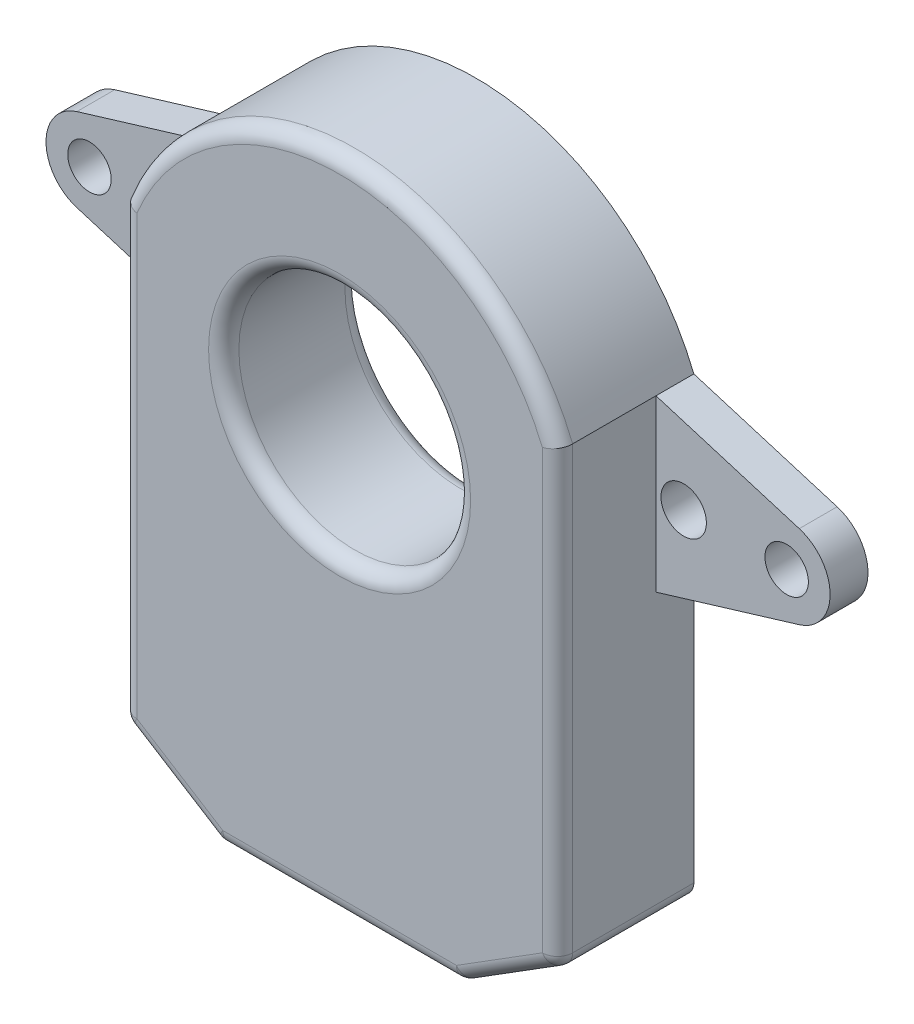
ISO-10303-21;
HEADER;
FILE_DESCRIPTION(('STEP AP214'),'2;1');
FILE_NAME('part.step','',(''),(''),'','','');
FILE_SCHEMA(('AUTOMOTIVE_DESIGN { 1 0 10303 214 1 1 1 1 }'));
ENDSEC;
DATA;
#1=APPLICATION_CONTEXT('core data for automotive mechanical design processes');
#2=APPLICATION_PROTOCOL_DEFINITION('international standard','automotive_design',2000,#1);
#3=PRODUCT_CONTEXT('',#1,'mechanical');
#4=PRODUCT('Part','Part','',(#3));
#5=PRODUCT_RELATED_PRODUCT_CATEGORY('part','',(#4));
#6=PRODUCT_DEFINITION_FORMATION('','',#4);
#7=PRODUCT_DEFINITION_CONTEXT('part definition',#1,'design');
#8=PRODUCT_DEFINITION('design','',#6,#7);
#9=PRODUCT_DEFINITION_SHAPE('','',#8);
#10=(LENGTH_UNIT() NAMED_UNIT(*) SI_UNIT(.MILLI.,.METRE.));
#11=(NAMED_UNIT(*) PLANE_ANGLE_UNIT() SI_UNIT($,.RADIAN.));
#12=(NAMED_UNIT(*) SI_UNIT($,.STERADIAN.) SOLID_ANGLE_UNIT());
#13=UNCERTAINTY_MEASURE_WITH_UNIT(LENGTH_MEASURE(1.E-05),#10,'distance_accuracy_value','');
#14=(GEOMETRIC_REPRESENTATION_CONTEXT(3) GLOBAL_UNCERTAINTY_ASSIGNED_CONTEXT((#13)) GLOBAL_UNIT_ASSIGNED_CONTEXT((#10,
#11,#12)) REPRESENTATION_CONTEXT('',''));
#15=CARTESIAN_POINT('',(0.,0.,0.));
#16=DIRECTION('',(0.,0.,1.));
#17=DIRECTION('',(1.,0.,0.));
#18=AXIS2_PLACEMENT_3D('',#15,#16,#17);
#19=CARTESIAN_POINT('',(14.385,27.88,9.));
#20=DIRECTION('',(0.,0.,-1.));
#21=DIRECTION('',(-1.,0.,0.));
#22=AXIS2_PLACEMENT_3D('',#19,#20,#21);
#23=PLANE('',#22);
#24=CARTESIAN_POINT('',(14.385,28.04,9.));
#25=DIRECTION('',(0.,0.,-1.));
#26=DIRECTION('',(-1.,0.,0.));
#27=AXIS2_PLACEMENT_3D('',#24,#25,#26);
#28=CIRCLE('',#27,8.65);
#29=CARTESIAN_POINT('',(5.73500000000001,28.04,9.));
#30=VERTEX_POINT('',#29);
#31=EDGE_CURVE('E307',#30,#30,#28,.T.);
#32=ORIENTED_EDGE('',*,*,#31,.T.);
#33=EDGE_LOOP('',(#32));
#34=FACE_BOUND('',#33,.T.);
#35=DIRECTION('',(0.847438604342457,-0.530893409141712,0.));
#36=VECTOR('',#35,1.);
#37=CARTESIAN_POINT('',(0.117910911010049,5.1061590416998,9.));
#38=LINE('',#37,#36);
#39=CARTESIAN_POINT('',(0.999999999999999,4.55355820286506,9.));
#40=VERTEX_POINT('',#39);
#41=CARTESIAN_POINT('',(6.67236728132335,1.,9.));
#42=VERTEX_POINT('',#41);
#43=EDGE_CURVE('E296',#40,#42,#38,.T.);
#44=ORIENTED_EDGE('',*,*,#43,.T.);
#45=DIRECTION('',(1.,0.,0.));
#46=VECTOR('',#45,1.);
#47=CARTESIAN_POINT('',(14.385,1.,9.));
#48=LINE('',#47,#46);
#49=CARTESIAN_POINT('',(22.0976327186766,1.,9.));
#50=VERTEX_POINT('',#49);
#51=EDGE_CURVE('E305',#42,#50,#48,.T.);
#52=ORIENTED_EDGE('',*,*,#51,.T.);
#53=DIRECTION('',(0.847438604342457,0.530893409141712,0.));
#54=VECTOR('',#53,1.);
#55=CARTESIAN_POINT('',(28.65208908899,5.1061590416998,9.));
#56=LINE('',#55,#54);
#57=CARTESIAN_POINT('',(27.77,4.55355820286506,9.));
#58=VERTEX_POINT('',#57);
#59=EDGE_CURVE('E303',#50,#58,#56,.T.);
#60=ORIENTED_EDGE('',*,*,#59,.T.);
#61=DIRECTION('',(0.,1.,0.));
#62=VECTOR('',#61,1.);
#63=CARTESIAN_POINT('',(27.77,27.88,9.));
#64=LINE('',#63,#62);
#65=CARTESIAN_POINT('',(27.77,33.45599991033,9.));
#66=VERTEX_POINT('',#65);
#67=EDGE_CURVE('E301',#58,#66,#64,.T.);
#68=ORIENTED_EDGE('',*,*,#67,.T.);
#69=CARTESIAN_POINT('',(14.385,27.88,9.));
#70=DIRECTION('',(0.,0.,-1.));
#71=DIRECTION('',(-1.,0.,0.));
#72=AXIS2_PLACEMENT_3D('',#69,#70,#71);
#73=CIRCLE('',#72,14.5);
#74=CARTESIAN_POINT('',(0.999999999999999,33.45599991033,9.));
#75=VERTEX_POINT('',#74);
#76=EDGE_CURVE('E298',#66,#75,#73,.F.);
#77=ORIENTED_EDGE('',*,*,#76,.T.);
#78=DIRECTION('',(0.,-1.,0.));
#79=VECTOR('',#78,1.);
#80=CARTESIAN_POINT('',(0.999999999999999,27.88,9.));
#81=LINE('',#80,#79);
#82=EDGE_CURVE('E294',#75,#40,#81,.T.);
#83=ORIENTED_EDGE('',*,*,#82,.T.);
#84=EDGE_LOOP('',(#44,#52,#60,#68,#77,#83));
#85=FACE_BOUND('',#84,.T.);
#86=ADVANCED_FACE('F33',(#34,#85),#23,.F.);
#87=CARTESIAN_POINT('',(14.385,27.88,0.));
#88=DIRECTION('',(0.,0.,-1.));
#89=DIRECTION('',(-1.,0.,0.));
#90=AXIS2_PLACEMENT_3D('',#87,#88,#89);
#91=PLANE('',#90);
#92=CARTESIAN_POINT('',(14.385,28.04,0.));
#93=DIRECTION('',(0.,0.,-1.));
#94=DIRECTION('',(-1.,0.,0.));
#95=AXIS2_PLACEMENT_3D('',#92,#93,#94);
#96=CIRCLE('',#95,8.65);
#97=CARTESIAN_POINT('',(5.73500000000001,28.04,0.));
#98=VERTEX_POINT('',#97);
#99=EDGE_CURVE('E285',#98,#98,#96,.F.);
#100=ORIENTED_EDGE('',*,*,#99,.T.);
#101=EDGE_LOOP('',(#100));
#102=FACE_BOUND('',#101,.T.);
#103=DIRECTION('',(0.847438604342457,0.530893409141711,0.));
#104=VECTOR('',#103,1.);
#105=CARTESIAN_POINT('',(22.385,0.,0.));
#106=LINE('',#105,#104);
#107=CARTESIAN_POINT('',(22.6285261278184,0.152561395657544,0.));
#108=VERTEX_POINT('',#107);
#109=CARTESIAN_POINT('',(28.3008934091417,3.7061195985226,0.));
#110=VERTEX_POINT('',#109);
#111=EDGE_CURVE('E261',#108,#110,#106,.T.);
#112=ORIENTED_EDGE('',*,*,#111,.F.);
#113=CARTESIAN_POINT('',(22.0976327186766,1.,0.));
#114=DIRECTION('',(0.,0.,-1.));
#115=DIRECTION('',(-1.,0.,0.));
#116=AXIS2_PLACEMENT_3D('',#113,#114,#115);
#117=CIRCLE('',#116,1.);
#118=CARTESIAN_POINT('',(22.0976327186766,0.,0.));
#119=VERTEX_POINT('',#118);
#120=EDGE_CURVE('E283',#108,#119,#117,.T.);
#121=ORIENTED_EDGE('',*,*,#120,.T.);
#122=DIRECTION('',(1.,0.,0.));
#123=VECTOR('',#122,1.);
#124=CARTESIAN_POINT('',(6.385,0.,0.));
#125=LINE('',#124,#123);
#126=CARTESIAN_POINT('',(6.67236728132336,0.,0.));
#127=VERTEX_POINT('',#126);
#128=EDGE_CURVE('E258',#127,#119,#125,.T.);
#129=ORIENTED_EDGE('',*,*,#128,.F.);
#130=CARTESIAN_POINT('',(6.67236728132336,1.,0.));
#131=DIRECTION('',(0.,0.,-1.));
#132=DIRECTION('',(-1.,0.,0.));
#133=AXIS2_PLACEMENT_3D('',#130,#131,#132);
#134=CIRCLE('',#133,1.);
#135=CARTESIAN_POINT('',(6.14147387218165,0.152561395657543,0.));
#136=VERTEX_POINT('',#135);
#137=EDGE_CURVE('E281',#127,#136,#134,.T.);
#138=ORIENTED_EDGE('',*,*,#137,.T.);
#139=DIRECTION('',(0.847438604342457,-0.530893409141711,0.));
#140=VECTOR('',#139,1.);
#141=CARTESIAN_POINT('',(6.385,0.,0.));
#142=LINE('',#141,#140);
#143=CARTESIAN_POINT('',(0.469106590858289,3.70611959852261,0.));
#144=VERTEX_POINT('',#143);
#145=EDGE_CURVE('E255',#144,#136,#142,.T.);
#146=ORIENTED_EDGE('',*,*,#145,.F.);
#147=CARTESIAN_POINT('',(1.,4.55355820286506,0.));
#148=DIRECTION('',(0.,0.,-1.));
#149=DIRECTION('',(-1.,0.,0.));
#150=AXIS2_PLACEMENT_3D('',#147,#148,#149);
#151=CIRCLE('',#150,1.);
#152=CARTESIAN_POINT('',(0.,4.55355820286506,0.));
#153=VERTEX_POINT('',#152);
#154=EDGE_CURVE('E278',#144,#153,#151,.T.);
#155=ORIENTED_EDGE('',*,*,#154,.T.);
#156=DIRECTION('',(0.,-1.,0.));
#157=VECTOR('',#156,1.);
#158=CARTESIAN_POINT('',(0.,4.,0.));
#159=LINE('',#158,#157);
#160=CARTESIAN_POINT('',(0.,22.4274983759205,0.));
#161=VERTEX_POINT('',#160);
#162=EDGE_CURVE('E269',#161,#153,#159,.T.);
#163=ORIENTED_EDGE('',*,*,#162,.F.);
#164=DIRECTION('',(-0.957046048370867,0.289935960683921,0.));
#165=VECTOR('',#164,1.);
#166=CARTESIAN_POINT('',(0.,22.4274983759205,0.));
#167=LINE('',#166,#165);
#168=CARTESIAN_POINT('',(-9.45961620716281,25.2932778411758,0.));
#169=VERTEX_POINT('',#168);
#170=EDGE_CURVE('E194',#161,#169,#167,.T.);
#171=ORIENTED_EDGE('',*,*,#170,.T.);
#172=CARTESIAN_POINT('',(-8.6275,28.04,0.));
#173=DIRECTION('',(0.,0.,-1.));
#174=DIRECTION('',(1.,0.,0.));
#175=AXIS2_PLACEMENT_3D('',#172,#173,#174);
#176=CIRCLE('',#175,2.86999999999989);
#177=CARTESIAN_POINT('',(-9.45961620716277,30.7867221588244,0.));
#178=VERTEX_POINT('',#177);
#179=EDGE_CURVE('E204',#169,#178,#176,.T.);
#180=ORIENTED_EDGE('',*,*,#179,.T.);
#181=DIRECTION('',(0.957046048370873,0.2899359606839,0.));
#182=VECTOR('',#181,1.);
#183=CARTESIAN_POINT('',(0.,33.6525016240795,0.));
#184=LINE('',#183,#182);
#185=CARTESIAN_POINT('',(0.,33.6525016240795,0.));
#186=VERTEX_POINT('',#185);
#187=EDGE_CURVE('E178',#178,#186,#184,.T.);
#188=ORIENTED_EDGE('',*,*,#187,.T.);
#189=CARTESIAN_POINT('',(14.385,27.88,0.));
#190=DIRECTION('',(0.,0.,1.));
#191=DIRECTION('',(-1.,0.,0.));
#192=AXIS2_PLACEMENT_3D('',#189,#190,#191);
#193=CIRCLE('',#192,15.5);
#194=CARTESIAN_POINT('',(28.77,33.6525016240795,0.));
#195=VERTEX_POINT('',#194);
#196=EDGE_CURVE('E267',#195,#186,#193,.T.);
#197=ORIENTED_EDGE('',*,*,#196,.F.);
#198=DIRECTION('',(0.957046048370873,-0.2899359606839,0.));
#199=VECTOR('',#198,1.);
#200=CARTESIAN_POINT('',(28.77,33.6525016240795,0.));
#201=LINE('',#200,#199);
#202=CARTESIAN_POINT('',(38.2296162071628,30.7867221588244,0.));
#203=VERTEX_POINT('',#202);
#204=EDGE_CURVE('E222',#195,#203,#201,.T.);
#205=ORIENTED_EDGE('',*,*,#204,.T.);
#206=CARTESIAN_POINT('',(37.3975,28.04,0.));
#207=DIRECTION('',(0.,0.,-1.));
#208=DIRECTION('',(-1.,0.,0.));
#209=AXIS2_PLACEMENT_3D('',#206,#207,#208);
#210=CIRCLE('',#209,2.87);
#211=CARTESIAN_POINT('',(38.2296162071628,25.2932778411756,0.));
#212=VERTEX_POINT('',#211);
#213=EDGE_CURVE('E241',#203,#212,#210,.T.);
#214=ORIENTED_EDGE('',*,*,#213,.T.);
#215=DIRECTION('',(-0.957046048370873,-0.2899359606839,0.));
#216=VECTOR('',#215,1.);
#217=CARTESIAN_POINT('',(28.77,22.4274983759205,0.));
#218=LINE('',#217,#216);
#219=CARTESIAN_POINT('',(28.77,22.4274983759205,0.));
#220=VERTEX_POINT('',#219);
#221=EDGE_CURVE('E229',#212,#220,#218,.T.);
#222=ORIENTED_EDGE('',*,*,#221,.T.);
#223=DIRECTION('',(0.,1.,0.));
#224=VECTOR('',#223,1.);
#225=CARTESIAN_POINT('',(28.77,33.6525016240795,0.));
#226=LINE('',#225,#224);
#227=CARTESIAN_POINT('',(28.77,4.55355820286506,0.));
#228=VERTEX_POINT('',#227);
#229=EDGE_CURVE('E264',#228,#220,#226,.T.);
#230=ORIENTED_EDGE('',*,*,#229,.F.);
#231=CARTESIAN_POINT('',(27.77,4.55355820286506,0.));
#232=DIRECTION('',(0.,0.,-1.));
#233=DIRECTION('',(-1.,0.,0.));
#234=AXIS2_PLACEMENT_3D('',#231,#232,#233);
#235=CIRCLE('',#234,1.);
#236=EDGE_CURVE('E276',#228,#110,#235,.T.);
#237=ORIENTED_EDGE('',*,*,#236,.T.);
#238=EDGE_LOOP('',(#112,#121,#129,#138,#146,#155,#163,#171,#180,#188,#197,#205,#214,#222,#230,#237));
#239=FACE_BOUND('',#238,.T.);
#240=CARTESIAN_POINT('',(37.3975,28.04,0.));
#241=DIRECTION('',(0.,0.,-1.));
#242=DIRECTION('',(-1.,0.,0.));
#243=AXIS2_PLACEMENT_3D('',#240,#241,#242);
#244=CIRCLE('',#243,1.435);
#245=CARTESIAN_POINT('',(35.9625,28.04,0.));
#246=VERTEX_POINT('',#245);
#247=EDGE_CURVE('E209',#246,#246,#244,.T.);
#248=ORIENTED_EDGE('',*,*,#247,.F.);
#249=EDGE_LOOP('',(#248));
#250=FACE_BOUND('',#249,.T.);
#251=CARTESIAN_POINT('',(30.6,28.04,0.));
#252=DIRECTION('',(0.,0.,-1.));
#253=DIRECTION('',(-1.,0.,0.));
#254=AXIS2_PLACEMENT_3D('',#251,#252,#253);
#255=CIRCLE('',#254,1.5);
#256=CARTESIAN_POINT('',(29.1,28.04,0.));
#257=VERTEX_POINT('',#256);
#258=EDGE_CURVE('E216',#257,#257,#255,.T.);
#259=ORIENTED_EDGE('',*,*,#258,.F.);
#260=EDGE_LOOP('',(#259));
#261=FACE_BOUND('',#260,.T.);
#262=CARTESIAN_POINT('',(-1.83,28.04,0.));
#263=DIRECTION('',(0.,0.,-1.));
#264=DIRECTION('',(1.,0.,0.));
#265=AXIS2_PLACEMENT_3D('',#262,#263,#264);
#266=CIRCLE('',#265,1.50000000000001);
#267=CARTESIAN_POINT('',(-0.329999999999991,28.04,0.));
#268=VERTEX_POINT('',#267);
#269=EDGE_CURVE('E470',#268,#268,#266,.T.);
#270=ORIENTED_EDGE('',*,*,#269,.F.);
#271=EDGE_LOOP('',(#270));
#272=FACE_BOUND('',#271,.T.);
#273=CARTESIAN_POINT('',(-8.6275,28.04,0.));
#274=DIRECTION('',(0.,0.,-1.));
#275=DIRECTION('',(1.,0.,0.));
#276=AXIS2_PLACEMENT_3D('',#273,#274,#275);
#277=CIRCLE('',#276,1.435);
#278=CARTESIAN_POINT('',(-7.19249999999999,28.04,0.));
#279=VERTEX_POINT('',#278);
#280=EDGE_CURVE('E199',#279,#279,#277,.T.);
#281=ORIENTED_EDGE('',*,*,#280,.F.);
#282=EDGE_LOOP('',(#281));
#283=FACE_BOUND('',#282,.T.);
#284=ADVANCED_FACE('F405',(#102,#239,#250,#261,#272,#283),#91,.T.);
#285=CARTESIAN_POINT('',(6.385,0.,9.));
#286=DIRECTION('',(0.530893409141712,0.847438604342457,0.));
#287=DIRECTION('',(-0.847438604342457,0.530893409141712,0.));
#288=AXIS2_PLACEMENT_3D('',#285,#286,#287);
#289=PLANE('',#288);
#290=ORIENTED_EDGE('',*,*,#145,.T.);
#291=DIRECTION('',(0.,0.,-1.));
#292=VECTOR('',#291,1.);
#293=CARTESIAN_POINT('',(6.14147387218165,0.152561395657543,9.));
#294=LINE('',#293,#292);
#295=CARTESIAN_POINT('',(6.14147387218165,0.152561395657543,8.));
#296=VERTEX_POINT('',#295);
#297=EDGE_CURVE('E329',#136,#296,#294,.F.);
#298=ORIENTED_EDGE('',*,*,#297,.T.);
#299=DIRECTION('',(0.847438604342457,-0.530893409141712,0.));
#300=VECTOR('',#299,1.);
#301=CARTESIAN_POINT('',(6.385,0.,8.));
#302=LINE('',#301,#300);
#303=CARTESIAN_POINT('',(0.469106590858289,3.70611959852261,8.));
#304=VERTEX_POINT('',#303);
#305=EDGE_CURVE('E325',#296,#304,#302,.F.);
#306=ORIENTED_EDGE('',*,*,#305,.T.);
#307=DIRECTION('',(0.,0.,-1.));
#308=VECTOR('',#307,1.);
#309=CARTESIAN_POINT('',(0.469106590858288,3.70611959852261,9.));
#310=LINE('',#309,#308);
#311=EDGE_CURVE('E327',#304,#144,#310,.T.);
#312=ORIENTED_EDGE('',*,*,#311,.T.);
#313=EDGE_LOOP('',(#290,#298,#306,#312));
#314=FACE_BOUND('',#313,.T.);
#315=ADVANCED_FACE('F412',(#314),#289,.F.);
#316=CARTESIAN_POINT('',(6.385,0.,9.));
#317=DIRECTION('',(0.,1.,0.));
#318=DIRECTION('',(0.,0.,1.));
#319=AXIS2_PLACEMENT_3D('',#316,#317,#318);
#320=PLANE('',#319);
#321=ORIENTED_EDGE('',*,*,#128,.T.);
#322=DIRECTION('',(0.,0.,-1.));
#323=VECTOR('',#322,1.);
#324=CARTESIAN_POINT('',(22.0976327186766,0.,9.));
#325=LINE('',#324,#323);
#326=CARTESIAN_POINT('',(22.0976327186766,0.,8.));
#327=VERTEX_POINT('',#326);
#328=EDGE_CURVE('E323',#119,#327,#325,.F.);
#329=ORIENTED_EDGE('',*,*,#328,.T.);
#330=DIRECTION('',(1.,0.,0.));
#331=VECTOR('',#330,1.);
#332=CARTESIAN_POINT('',(6.385,0.,8.));
#333=LINE('',#332,#331);
#334=CARTESIAN_POINT('',(6.67236728132336,0.,8.));
#335=VERTEX_POINT('',#334);
#336=EDGE_CURVE('E319',#327,#335,#333,.F.);
#337=ORIENTED_EDGE('',*,*,#336,.T.);
#338=DIRECTION('',(0.,0.,-1.));
#339=VECTOR('',#338,1.);
#340=CARTESIAN_POINT('',(6.67236728132336,0.,9.));
#341=LINE('',#340,#339);
#342=EDGE_CURVE('E321',#335,#127,#341,.T.);
#343=ORIENTED_EDGE('',*,*,#342,.T.);
#344=EDGE_LOOP('',(#321,#329,#337,#343));
#345=FACE_BOUND('',#344,.T.);
#346=ADVANCED_FACE('F433',(#345),#320,.F.);
#347=CARTESIAN_POINT('',(22.385,0.,9.));
#348=DIRECTION('',(-0.530893409141712,0.847438604342457,0.));
#349=DIRECTION('',(-0.847438604342457,-0.530893409141712,0.));
#350=AXIS2_PLACEMENT_3D('',#347,#348,#349);
#351=PLANE('',#350);
#352=DIRECTION('',(0.847438604342457,0.530893409141712,0.));
#353=VECTOR('',#352,1.);
#354=CARTESIAN_POINT('',(22.385,0.,8.));
#355=LINE('',#354,#353);
#356=CARTESIAN_POINT('',(28.3008934091417,3.70611959852261,8.));
#357=VERTEX_POINT('',#356);
#358=CARTESIAN_POINT('',(22.6285261278184,0.152561395657544,8.));
#359=VERTEX_POINT('',#358);
#360=EDGE_CURVE('E313',#357,#359,#355,.F.);
#361=ORIENTED_EDGE('',*,*,#360,.T.);
#362=DIRECTION('',(0.,0.,-1.));
#363=VECTOR('',#362,1.);
#364=CARTESIAN_POINT('',(22.6285261278184,0.152561395657544,9.));
#365=LINE('',#364,#363);
#366=EDGE_CURVE('E317',#359,#108,#365,.T.);
#367=ORIENTED_EDGE('',*,*,#366,.T.);
#368=ORIENTED_EDGE('',*,*,#111,.T.);
#369=DIRECTION('',(0.,0.,-1.));
#370=VECTOR('',#369,1.);
#371=CARTESIAN_POINT('',(28.3008934091417,3.70611959852261,9.));
#372=LINE('',#371,#370);
#373=EDGE_CURVE('E315',#110,#357,#372,.F.);
#374=ORIENTED_EDGE('',*,*,#373,.T.);
#375=EDGE_LOOP('',(#361,#367,#368,#374));
#376=FACE_BOUND('',#375,.T.);
#377=ADVANCED_FACE('F429',(#376),#351,.F.);
#378=CARTESIAN_POINT('',(28.77,33.6525016240795,9.));
#379=DIRECTION('',(-1.,0.,0.));
#380=DIRECTION('',(0.,0.,1.));
#381=AXIS2_PLACEMENT_3D('',#378,#379,#380);
#382=PLANE('',#381);
#383=ORIENTED_EDGE('',*,*,#229,.T.);
#384=DIRECTION('',(0.,0.,-1.));
#385=VECTOR('',#384,1.);
#386=CARTESIAN_POINT('',(28.77,22.4274983759205,2.5));
#387=LINE('',#386,#385);
#388=CARTESIAN_POINT('',(28.77,22.4274983759205,2.5));
#389=VERTEX_POINT('',#388);
#390=EDGE_CURVE('E246',#389,#220,#387,.T.);
#391=ORIENTED_EDGE('',*,*,#390,.F.);
#392=DIRECTION('',(0.,1.,0.));
#393=VECTOR('',#392,1.);
#394=CARTESIAN_POINT('',(28.77,33.6525016240795,2.5));
#395=LINE('',#394,#393);
#396=CARTESIAN_POINT('',(28.77,33.6525016240795,2.5));
#397=VERTEX_POINT('',#396);
#398=EDGE_CURVE('E225',#389,#397,#395,.T.);
#399=ORIENTED_EDGE('',*,*,#398,.T.);
#400=DIRECTION('',(0.,0.,-1.));
#401=VECTOR('',#400,1.);
#402=CARTESIAN_POINT('',(28.77,33.6525016240795,9.));
#403=LINE('',#402,#401);
#404=CARTESIAN_POINT('',(28.77,33.6525016240795,8.));
#405=VERTEX_POINT('',#404);
#406=EDGE_CURVE('E273',#405,#397,#403,.T.);
#407=ORIENTED_EDGE('',*,*,#406,.F.);
#408=DIRECTION('',(0.,1.,0.));
#409=VECTOR('',#408,1.);
#410=CARTESIAN_POINT('',(28.77,33.6525016240795,8.));
#411=LINE('',#410,#409);
#412=CARTESIAN_POINT('',(28.77,4.55355820286506,8.));
#413=VERTEX_POINT('',#412);
#414=EDGE_CURVE('E42',#405,#413,#411,.F.);
#415=ORIENTED_EDGE('',*,*,#414,.T.);
#416=DIRECTION('',(0.,0.,-1.));
#417=VECTOR('',#416,1.);
#418=CARTESIAN_POINT('',(28.77,4.55355820286506,9.));
#419=LINE('',#418,#417);
#420=EDGE_CURVE('E11',#413,#228,#419,.T.);
#421=ORIENTED_EDGE('',*,*,#420,.T.);
#422=EDGE_LOOP('',(#383,#391,#399,#407,#415,#421));
#423=FACE_BOUND('',#422,.T.);
#424=ADVANCED_FACE('F426',(#423),#382,.F.);
#425=CARTESIAN_POINT('',(14.385,27.88,9.));
#426=DIRECTION('',(0.,0.,-1.));
#427=DIRECTION('',(-1.,0.,0.));
#428=AXIS2_PLACEMENT_3D('',#425,#426,#427);
#429=CYLINDRICAL_SURFACE('',#428,15.5);
#430=DIRECTION('',(0.,0.,-1.));
#431=VECTOR('',#430,1.);
#432=CARTESIAN_POINT('',(0.,33.6525016240795,9.));
#433=LINE('',#432,#431);
#434=CARTESIAN_POINT('',(0.,33.6525016240795,8.));
#435=VERTEX_POINT('',#434);
#436=CARTESIAN_POINT('',(0.,33.6525016240795,2.5));
#437=VERTEX_POINT('',#436);
#438=EDGE_CURVE('E271',#435,#437,#433,.T.);
#439=ORIENTED_EDGE('',*,*,#438,.F.);
#440=CARTESIAN_POINT('',(14.385,27.88,8.));
#441=DIRECTION('',(0.,0.,-1.));
#442=DIRECTION('',(-1.,0.,0.));
#443=AXIS2_PLACEMENT_3D('',#440,#441,#442);
#444=CIRCLE('',#443,15.5);
#445=EDGE_CURVE('E310',#435,#405,#444,.T.);
#446=ORIENTED_EDGE('',*,*,#445,.T.);
#447=ORIENTED_EDGE('',*,*,#406,.T.);
#448=DIRECTION('',(0.,0.,-1.));
#449=VECTOR('',#448,1.);
#450=CARTESIAN_POINT('',(28.77,33.6525016240795,2.5));
#451=LINE('',#450,#449);
#452=EDGE_CURVE('E238',#397,#195,#451,.T.);
#453=ORIENTED_EDGE('',*,*,#452,.T.);
#454=ORIENTED_EDGE('',*,*,#196,.T.);
#455=DIRECTION('',(0.,0.,-1.));
#456=VECTOR('',#455,1.);
#457=CARTESIAN_POINT('',(0.,33.6525016240795,2.5));
#458=LINE('',#457,#456);
#459=EDGE_CURVE('E58',#437,#186,#458,.T.);
#460=ORIENTED_EDGE('',*,*,#459,.F.);
#461=EDGE_LOOP('',(#439,#446,#447,#453,#454,#460));
#462=FACE_BOUND('',#461,.T.);
#463=ADVANCED_FACE('F423',(#462),#429,.T.);
#464=CARTESIAN_POINT('',(0.,4.,9.));
#465=DIRECTION('',(1.,0.,0.));
#466=DIRECTION('',(0.,0.,-1.));
#467=AXIS2_PLACEMENT_3D('',#464,#465,#466);
#468=PLANE('',#467);
#469=DIRECTION('',(0.,-1.,0.));
#470=VECTOR('',#469,1.);
#471=CARTESIAN_POINT('',(0.,33.6525016240795,2.5));
#472=LINE('',#471,#470);
#473=CARTESIAN_POINT('',(0.,22.4274983759205,2.5));
#474=VERTEX_POINT('',#473);
#475=EDGE_CURVE('E50',#437,#474,#472,.T.);
#476=ORIENTED_EDGE('',*,*,#475,.T.);
#477=DIRECTION('',(0.,0.,-1.));
#478=VECTOR('',#477,1.);
#479=CARTESIAN_POINT('',(0.,22.4274983759205,2.5));
#480=LINE('',#479,#478);
#481=EDGE_CURVE('E210',#474,#161,#480,.T.);
#482=ORIENTED_EDGE('',*,*,#481,.T.);
#483=ORIENTED_EDGE('',*,*,#162,.T.);
#484=DIRECTION('',(0.,0.,-1.));
#485=VECTOR('',#484,1.);
#486=CARTESIAN_POINT('',(0.,4.55355820286506,9.));
#487=LINE('',#486,#485);
#488=CARTESIAN_POINT('',(0.,4.55355820286506,8.));
#489=VERTEX_POINT('',#488);
#490=EDGE_CURVE('E333',#153,#489,#487,.F.);
#491=ORIENTED_EDGE('',*,*,#490,.T.);
#492=DIRECTION('',(0.,-1.,0.));
#493=VECTOR('',#492,1.);
#494=CARTESIAN_POINT('',(0.,4.,8.));
#495=LINE('',#494,#493);
#496=EDGE_CURVE('E331',#489,#435,#495,.F.);
#497=ORIENTED_EDGE('',*,*,#496,.T.);
#498=ORIENTED_EDGE('',*,*,#438,.T.);
#499=EDGE_LOOP('',(#476,#482,#483,#491,#497,#498));
#500=FACE_BOUND('',#499,.T.);
#501=ADVANCED_FACE('F420',(#500),#468,.F.);
#502=CARTESIAN_POINT('',(14.385,28.04,9.));
#503=DIRECTION('',(0.,0.,-1.));
#504=DIRECTION('',(-1.,0.,0.));
#505=AXIS2_PLACEMENT_3D('',#502,#503,#504);
#506=CYLINDRICAL_SURFACE('',#505,7.65);
#507=CARTESIAN_POINT('',(14.385,28.04,0.999999999999999));
#508=DIRECTION('',(0.,0.,-1.));
#509=DIRECTION('',(-1.,0.,0.));
#510=AXIS2_PLACEMENT_3D('',#507,#508,#509);
#511=CIRCLE('',#510,7.65);
#512=CARTESIAN_POINT('',(6.73500000000001,28.04,0.999999999999999));
#513=VERTEX_POINT('',#512);
#514=EDGE_CURVE('E291',#513,#513,#511,.T.);
#515=ORIENTED_EDGE('',*,*,#514,.T.);
#516=EDGE_LOOP('',(#515));
#517=FACE_BOUND('',#516,.T.);
#518=CARTESIAN_POINT('',(14.385,28.04,8.));
#519=DIRECTION('',(0.,0.,-1.));
#520=DIRECTION('',(-1.,0.,0.));
#521=AXIS2_PLACEMENT_3D('',#518,#519,#520);
#522=CIRCLE('',#521,7.65);
#523=CARTESIAN_POINT('',(6.73500000000001,28.04,8.));
#524=VERTEX_POINT('',#523);
#525=EDGE_CURVE('E288',#524,#524,#522,.F.);
#526=ORIENTED_EDGE('',*,*,#525,.T.);
#527=EDGE_LOOP('',(#526));
#528=FACE_BOUND('',#527,.T.);
#529=ADVANCED_FACE('F417',(#517,#528),#506,.F.);
#530=CARTESIAN_POINT('',(14.385,28.04,0.999999999999999));
#531=DIRECTION('',(0.,0.,-1.));
#532=DIRECTION('',(-1.,0.,0.));
#533=AXIS2_PLACEMENT_3D('',#530,#531,#532);
#534=TOROIDAL_SURFACE('',#533,8.65,1.);
#535=ORIENTED_EDGE('',*,*,#514,.F.);
#536=EDGE_LOOP('',(#535));
#537=FACE_BOUND('',#536,.T.);
#538=ORIENTED_EDGE('',*,*,#99,.F.);
#539=EDGE_LOOP('',(#538));
#540=FACE_BOUND('',#539,.T.);
#541=ADVANCED_FACE('F440',(#537,#540),#534,.T.);
#542=CARTESIAN_POINT('',(14.385,28.04,8.));
#543=DIRECTION('',(0.,0.,-1.));
#544=DIRECTION('',(-1.,0.,0.));
#545=AXIS2_PLACEMENT_3D('',#542,#543,#544);
#546=TOROIDAL_SURFACE('',#545,8.65,1.);
#547=ORIENTED_EDGE('',*,*,#31,.F.);
#548=EDGE_LOOP('',(#547));
#549=FACE_BOUND('',#548,.T.);
#550=ORIENTED_EDGE('',*,*,#525,.F.);
#551=EDGE_LOOP('',(#550));
#552=FACE_BOUND('',#551,.T.);
#553=ADVANCED_FACE('F401',(#549,#552),#546,.T.);
#554=CARTESIAN_POINT('',(22.0976327186766,1.,9.));
#555=DIRECTION('',(0.,0.,-1.));
#556=DIRECTION('',(-1.,0.,0.));
#557=AXIS2_PLACEMENT_3D('',#554,#555,#556);
#558=CYLINDRICAL_SURFACE('',#557,1.);
#559=ORIENTED_EDGE('',*,*,#120,.F.);
#560=ORIENTED_EDGE('',*,*,#366,.F.);
#561=CARTESIAN_POINT('',(22.0976327186766,1.,8.));
#562=DIRECTION('',(0.,0.,1.));
#563=DIRECTION('',(1.,0.,0.));
#564=AXIS2_PLACEMENT_3D('',#561,#562,#563);
#565=CIRCLE('',#564,1.);
#566=EDGE_CURVE('E37',#327,#359,#565,.T.);
#567=ORIENTED_EDGE('',*,*,#566,.F.);
#568=ORIENTED_EDGE('',*,*,#328,.F.);
#569=EDGE_LOOP('',(#559,#560,#567,#568));
#570=FACE_BOUND('',#569,.T.);
#571=ADVANCED_FACE('F35',(#570),#558,.T.);
#572=CARTESIAN_POINT('',(14.385,1.,8.));
#573=DIRECTION('',(1.,0.,0.));
#574=DIRECTION('',(0.,0.,-1.));
#575=AXIS2_PLACEMENT_3D('',#572,#573,#574);
#576=CYLINDRICAL_SURFACE('',#575,1.);
#577=CARTESIAN_POINT('',(6.67236728132336,1.,8.));
#578=DIRECTION('',(-1.,0.,0.));
#579=DIRECTION('',(0.,0.,1.));
#580=AXIS2_PLACEMENT_3D('',#577,#578,#579);
#581=CIRCLE('',#580,1.);
#582=EDGE_CURVE('E581',#335,#42,#581,.T.);
#583=ORIENTED_EDGE('',*,*,#582,.F.);
#584=ORIENTED_EDGE('',*,*,#336,.F.);
#585=CARTESIAN_POINT('',(22.0976327186766,1.,8.));
#586=DIRECTION('',(1.,0.,0.));
#587=DIRECTION('',(0.,0.,-1.));
#588=AXIS2_PLACEMENT_3D('',#585,#586,#587);
#589=CIRCLE('',#588,1.);
#590=EDGE_CURVE('E583',#50,#327,#589,.T.);
#591=ORIENTED_EDGE('',*,*,#590,.F.);
#592=ORIENTED_EDGE('',*,*,#51,.F.);
#593=EDGE_LOOP('',(#583,#584,#591,#592));
#594=FACE_BOUND('',#593,.T.);
#595=ADVANCED_FACE('F394',(#594),#576,.T.);
#596=CARTESIAN_POINT('',(6.67236728132336,1.,9.));
#597=DIRECTION('',(0.,0.,-1.));
#598=DIRECTION('',(-1.,0.,0.));
#599=AXIS2_PLACEMENT_3D('',#596,#597,#598);
#600=CYLINDRICAL_SURFACE('',#599,1.);
#601=ORIENTED_EDGE('',*,*,#137,.F.);
#602=ORIENTED_EDGE('',*,*,#342,.F.);
#603=CARTESIAN_POINT('',(6.67236728132336,1.,8.));
#604=DIRECTION('',(0.,0.,1.));
#605=DIRECTION('',(1.,0.,0.));
#606=AXIS2_PLACEMENT_3D('',#603,#604,#605);
#607=CIRCLE('',#606,1.);
#608=EDGE_CURVE('E578',#296,#335,#607,.T.);
#609=ORIENTED_EDGE('',*,*,#608,.F.);
#610=ORIENTED_EDGE('',*,*,#297,.F.);
#611=EDGE_LOOP('',(#601,#602,#609,#610));
#612=FACE_BOUND('',#611,.T.);
#613=ADVANCED_FACE('F391',(#612),#600,.T.);
#614=CARTESIAN_POINT('',(22.0976327186766,1.,8.));
#615=DIRECTION('',(0.,0.,1.));
#616=DIRECTION('',(1.,0.,0.));
#617=AXIS2_PLACEMENT_3D('',#614,#615,#616);
#618=SPHERICAL_SURFACE('',#617,1.);
#619=ORIENTED_EDGE('',*,*,#590,.T.);
#620=ORIENTED_EDGE('',*,*,#566,.T.);
#621=CARTESIAN_POINT('',(22.0976327186766,1.,8.));
#622=DIRECTION('',(-0.847438604342457,-0.530893409141711,0.));
#623=DIRECTION('',(0.530893409141711,-0.847438604342457,0.));
#624=AXIS2_PLACEMENT_3D('',#621,#622,#623);
#625=CIRCLE('',#624,1.);
#626=EDGE_CURVE('E571',#50,#359,#625,.F.);
#627=ORIENTED_EDGE('',*,*,#626,.F.);
#628=EDGE_LOOP('',(#619,#620,#627));
#629=FACE_BOUND('',#628,.T.);
#630=ADVANCED_FACE('F387',(#629),#618,.T.);
#631=CARTESIAN_POINT('',(6.67236728132336,1.,8.));
#632=DIRECTION('',(0.,0.,1.));
#633=DIRECTION('',(1.,0.,0.));
#634=AXIS2_PLACEMENT_3D('',#631,#632,#633);
#635=SPHERICAL_SURFACE('',#634,1.);
#636=ORIENTED_EDGE('',*,*,#608,.T.);
#637=ORIENTED_EDGE('',*,*,#582,.T.);
#638=CARTESIAN_POINT('',(6.67236728132335,1.,8.));
#639=DIRECTION('',(0.847438604342459,-0.530893409141708,0.));
#640=DIRECTION('',(0.530893409141708,0.847438604342459,0.));
#641=AXIS2_PLACEMENT_3D('',#638,#639,#640);
#642=CIRCLE('',#641,1.);
#643=EDGE_CURVE('E568',#296,#42,#642,.F.);
#644=ORIENTED_EDGE('',*,*,#643,.F.);
#645=EDGE_LOOP('',(#636,#637,#644));
#646=FACE_BOUND('',#645,.T.);
#647=ADVANCED_FACE('F383',(#646),#635,.T.);
#648=CARTESIAN_POINT('',(27.77,4.55355820286506,9.));
#649=DIRECTION('',(0.,0.,-1.));
#650=DIRECTION('',(-1.,0.,0.));
#651=AXIS2_PLACEMENT_3D('',#648,#649,#650);
#652=CYLINDRICAL_SURFACE('',#651,1.);
#653=ORIENTED_EDGE('',*,*,#236,.F.);
#654=ORIENTED_EDGE('',*,*,#420,.F.);
#655=CARTESIAN_POINT('',(27.77,4.55355820286506,8.));
#656=DIRECTION('',(0.,0.,1.));
#657=DIRECTION('',(1.,0.,0.));
#658=AXIS2_PLACEMENT_3D('',#655,#656,#657);
#659=CIRCLE('',#658,1.);
#660=EDGE_CURVE('E564',#357,#413,#659,.T.);
#661=ORIENTED_EDGE('',*,*,#660,.F.);
#662=ORIENTED_EDGE('',*,*,#373,.F.);
#663=EDGE_LOOP('',(#653,#654,#661,#662));
#664=FACE_BOUND('',#663,.T.);
#665=ADVANCED_FACE('F379',(#664),#652,.T.);
#666=CARTESIAN_POINT('',(28.6520890889899,5.1061590416998,8.));
#667=DIRECTION('',(0.847438604342457,0.530893409141712,0.));
#668=DIRECTION('',(-0.530893409141712,0.847438604342457,0.));
#669=AXIS2_PLACEMENT_3D('',#666,#667,#668);
#670=CYLINDRICAL_SURFACE('',#669,1.);
#671=ORIENTED_EDGE('',*,*,#626,.T.);
#672=ORIENTED_EDGE('',*,*,#360,.F.);
#673=CARTESIAN_POINT('',(27.77,4.55355820286506,8.));
#674=DIRECTION('',(0.847438604342457,0.530893409141712,0.));
#675=DIRECTION('',(-0.530893409141712,0.847438604342457,0.));
#676=AXIS2_PLACEMENT_3D('',#673,#674,#675);
#677=CIRCLE('',#676,1.);
#678=EDGE_CURVE('E567',#58,#357,#677,.T.);
#679=ORIENTED_EDGE('',*,*,#678,.F.);
#680=ORIENTED_EDGE('',*,*,#59,.F.);
#681=EDGE_LOOP('',(#671,#672,#679,#680));
#682=FACE_BOUND('',#681,.T.);
#683=ADVANCED_FACE('F375',(#682),#670,.T.);
#684=CARTESIAN_POINT('',(0.117910911010051,5.1061590416998,8.));
#685=DIRECTION('',(0.847438604342457,-0.530893409141712,0.));
#686=DIRECTION('',(0.530893409141712,0.847438604342457,0.));
#687=AXIS2_PLACEMENT_3D('',#684,#685,#686);
#688=CYLINDRICAL_SURFACE('',#687,1.);
#689=ORIENTED_EDGE('',*,*,#643,.T.);
#690=ORIENTED_EDGE('',*,*,#43,.F.);
#691=CARTESIAN_POINT('',(1.,4.55355820286506,8.));
#692=DIRECTION('',(-0.847438604342457,0.530893409141712,0.));
#693=DIRECTION('',(-0.530893409141712,-0.847438604342457,0.));
#694=AXIS2_PLACEMENT_3D('',#691,#692,#693);
#695=CIRCLE('',#694,1.);
#696=EDGE_CURVE('E542',#304,#40,#695,.T.);
#697=ORIENTED_EDGE('',*,*,#696,.F.);
#698=ORIENTED_EDGE('',*,*,#305,.F.);
#699=EDGE_LOOP('',(#689,#690,#697,#698));
#700=FACE_BOUND('',#699,.T.);
#701=ADVANCED_FACE('F371',(#700),#688,.T.);
#702=CARTESIAN_POINT('',(1.,4.55355820286506,9.));
#703=DIRECTION('',(0.,0.,-1.));
#704=DIRECTION('',(-1.,0.,0.));
#705=AXIS2_PLACEMENT_3D('',#702,#703,#704);
#706=CYLINDRICAL_SURFACE('',#705,1.);
#707=ORIENTED_EDGE('',*,*,#154,.F.);
#708=ORIENTED_EDGE('',*,*,#311,.F.);
#709=CARTESIAN_POINT('',(1.,4.55355820286506,8.));
#710=DIRECTION('',(0.,0.,1.));
#711=DIRECTION('',(1.,0.,0.));
#712=AXIS2_PLACEMENT_3D('',#709,#710,#711);
#713=CIRCLE('',#712,1.);
#714=EDGE_CURVE('E538',#489,#304,#713,.T.);
#715=ORIENTED_EDGE('',*,*,#714,.F.);
#716=ORIENTED_EDGE('',*,*,#490,.F.);
#717=EDGE_LOOP('',(#707,#708,#715,#716));
#718=FACE_BOUND('',#717,.T.);
#719=ADVANCED_FACE('F367',(#718),#706,.T.);
#720=CARTESIAN_POINT('',(27.77,4.55355820286506,8.));
#721=DIRECTION('',(0.,0.,1.));
#722=DIRECTION('',(1.,0.,0.));
#723=AXIS2_PLACEMENT_3D('',#720,#721,#722);
#724=SPHERICAL_SURFACE('',#723,1.);
#725=ORIENTED_EDGE('',*,*,#678,.T.);
#726=ORIENTED_EDGE('',*,*,#660,.T.);
#727=CARTESIAN_POINT('',(27.77,4.55355820286506,8.));
#728=DIRECTION('',(0.,-1.,0.));
#729=DIRECTION('',(0.,0.,-1.));
#730=AXIS2_PLACEMENT_3D('',#727,#728,#729);
#731=CIRCLE('',#730,1.);
#732=EDGE_CURVE('E543',#58,#413,#731,.F.);
#733=ORIENTED_EDGE('',*,*,#732,.F.);
#734=EDGE_LOOP('',(#725,#726,#733));
#735=FACE_BOUND('',#734,.T.);
#736=ADVANCED_FACE('F363',(#735),#724,.T.);
#737=CARTESIAN_POINT('',(1.,4.55355820286506,8.));
#738=DIRECTION('',(0.,0.,1.));
#739=DIRECTION('',(1.,0.,0.));
#740=AXIS2_PLACEMENT_3D('',#737,#738,#739);
#741=SPHERICAL_SURFACE('',#740,1.);
#742=ORIENTED_EDGE('',*,*,#714,.T.);
#743=ORIENTED_EDGE('',*,*,#696,.T.);
#744=CARTESIAN_POINT('',(0.999999999999999,4.55355820286506,8.));
#745=DIRECTION('',(0.,-1.,0.));
#746=DIRECTION('',(1.,0.,0.));
#747=AXIS2_PLACEMENT_3D('',#744,#745,#746);
#748=CIRCLE('',#747,1.);
#749=EDGE_CURVE('E546',#489,#40,#748,.F.);
#750=ORIENTED_EDGE('',*,*,#749,.F.);
#751=EDGE_LOOP('',(#742,#743,#750));
#752=FACE_BOUND('',#751,.T.);
#753=ADVANCED_FACE('F359',(#752),#741,.T.);
#754=CARTESIAN_POINT('',(27.77,27.88,8.));
#755=DIRECTION('',(0.,1.,0.));
#756=DIRECTION('',(0.,0.,1.));
#757=AXIS2_PLACEMENT_3D('',#754,#755,#756);
#758=CYLINDRICAL_SURFACE('',#757,1.);
#759=ORIENTED_EDGE('',*,*,#732,.T.);
#760=ORIENTED_EDGE('',*,*,#414,.F.);
#761=CARTESIAN_POINT('',(28.77,33.6525016240795,8.));
#762=CARTESIAN_POINT('',(28.7700000805511,33.6525015975052,8.02775983213397));
#763=CARTESIAN_POINT('',(28.7688433394304,33.6522782113687,8.05550623709784));
#764=CARTESIAN_POINT('',(28.7642304155308,33.6513871054705,8.11079772308256));
#765=CARTESIAN_POINT('',(28.7607744239697,33.6507194226588,8.13834282065262));
#766=CARTESIAN_POINT('',(28.7469977217468,33.6480571494395,8.22030756374714));
#767=CARTESIAN_POINT('',(28.7332681466979,33.6454033106113,8.27417361593061));
#768=CARTESIAN_POINT('',(28.6971408107474,33.6384122011936,8.37878425149402));
#769=CARTESIAN_POINT('',(28.6747404238399,33.6340744206114,8.42952788382994));
#770=CARTESIAN_POINT('',(28.6219610066305,33.6238379282743,8.52650563258272));
#771=CARTESIAN_POINT('',(28.5915826829972,33.6179393547706,8.57274014791034));
#772=CARTESIAN_POINT('',(28.5234925918,33.6046927917421,8.65979304498923));
#773=CARTESIAN_POINT('',(28.4857260956993,33.597333979142,8.70056692578791));
#774=CARTESIAN_POINT('',(28.404107103057,33.5813943242363,8.77522111311613));
#775=CARTESIAN_POINT('',(28.360252576363,33.572813074264,8.80909911076885));
#776=CARTESIAN_POINT('',(28.2669061620956,33.5545009442891,8.86961672156666));
#777=CARTESIAN_POINT('',(28.2173293116461,33.5447526276932,8.89611982224698));
#778=CARTESIAN_POINT('',(28.1145872023833,33.5244934856818,8.94041720129627));
#779=CARTESIAN_POINT('',(28.0614238191832,33.5139830586076,8.95821599210745));
#780=CARTESIAN_POINT('',(27.9700027171157,33.4958557565603,8.9805467440267));
#781=CARTESIAN_POINT('',(27.932286913066,33.4883627000753,8.98748738019618));
#782=CARTESIAN_POINT('',(27.85637590406,33.4732504054162,8.99699411801461));
#783=CARTESIAN_POINT('',(27.8181816314344,33.4656314054899,8.99956769605504));
#784=CARTESIAN_POINT('',(27.7766671434765,33.4573329810688,8.99998336978344));
#785=CARTESIAN_POINT('',(27.7733334250256,33.4566664765858,9.00000004354128));
#786=CARTESIAN_POINT('',(27.77,33.45599991033,9.));
#787=B_SPLINE_CURVE_WITH_KNOTS('',3,(#761,#762,#763,#764,#765,#766,#767,#768,#769,#770,#771,
#772,#773,#774,#775,#776,#777,#778,#779,#780,#781,#782,#783,#784,#785,#786),.UNSPECIFIED.,.F.,
.F.,(4,2,2,2,2,2,2,2,2,2,2,2,4),(0.,0.083227906259301,0.166448891706432,0.33254449717444,
0.498690445070976,0.664821681075617,0.832233631522453,0.999701542902646,1.17008951635137,
1.34038906428406,1.45739389840703,1.57419821772304,1.58439722353391),.UNSPECIFIED.);
#788=EDGE_CURVE('E342',#66,#405,#787,.F.);
#789=ORIENTED_EDGE('',*,*,#788,.F.);
#790=ORIENTED_EDGE('',*,*,#67,.F.);
#791=EDGE_LOOP('',(#759,#760,#789,#790));
#792=FACE_BOUND('',#791,.T.);
#793=ADVANCED_FACE('F354',(#792),#758,.T.);
#794=CARTESIAN_POINT('',(0.999999999999999,27.88,8.));
#795=DIRECTION('',(0.,-1.,0.));
#796=DIRECTION('',(0.,0.,-1.));
#797=AXIS2_PLACEMENT_3D('',#794,#795,#796);
#798=CYLINDRICAL_SURFACE('',#797,1.);
#799=ORIENTED_EDGE('',*,*,#749,.T.);
#800=ORIENTED_EDGE('',*,*,#82,.F.);
#801=CARTESIAN_POINT('',(0.,33.6525016240795,8.));
#802=CARTESIAN_POINT('',(-8.05510850986119E-08,33.6525015975052,8.02775983213397));
#803=CARTESIAN_POINT('',(0.00115666056955159,33.6522782113687,8.05550623709784));
#804=CARTESIAN_POINT('',(0.00576958446921193,33.6513871054705,8.11079772308256));
#805=CARTESIAN_POINT('',(0.00922557603028677,33.6507194226588,8.13834282065262));
#806=CARTESIAN_POINT('',(0.0230022782532273,33.6480571494395,8.22030756374714));
#807=CARTESIAN_POINT('',(0.0367318533020668,33.6454033106113,8.27417361593061));
#808=CARTESIAN_POINT('',(0.0728591892525674,33.6384122011936,8.37878425149402));
#809=CARTESIAN_POINT('',(0.0952595761600978,33.6340744206114,8.42952788382994));
#810=CARTESIAN_POINT('',(0.148038993369482,33.6238379282743,8.52650563258272));
#811=CARTESIAN_POINT('',(0.178417317002761,33.6179393547706,8.57274014791034));
#812=CARTESIAN_POINT('',(0.246507408199954,33.6046927917421,8.65979304498923));
#813=CARTESIAN_POINT('',(0.284273904300747,33.597333979142,8.70056692578792));
#814=CARTESIAN_POINT('',(0.365892896943,33.5813943242363,8.77522111311613));
#815=CARTESIAN_POINT('',(0.409747423637026,33.572813074264,8.80909911076886));
#816=CARTESIAN_POINT('',(0.503093837904426,33.5545009442891,8.86961672156666));
#817=CARTESIAN_POINT('',(0.552670688353939,33.5447526276932,8.89611982224698));
#818=CARTESIAN_POINT('',(0.655412797616726,33.5244934856818,8.94041720129627));
#819=CARTESIAN_POINT('',(0.708576180816791,33.5139830586076,8.95821599210745));
#820=CARTESIAN_POINT('',(0.799997282884302,33.4958557565603,8.9805467440267));
#821=CARTESIAN_POINT('',(0.837713086933986,33.4883627000753,8.98748738019618));
#822=CARTESIAN_POINT('',(0.913624095940011,33.4732504054162,8.99699411801461));
#823=CARTESIAN_POINT('',(0.951818368565619,33.4656314054898,8.99956769605504));
#824=CARTESIAN_POINT('',(0.993332856523449,33.4573329810687,8.99998336978344));
#825=CARTESIAN_POINT('',(0.996666574974351,33.4566664765858,9.00000004354128));
#826=CARTESIAN_POINT('',(0.999999999999997,33.45599991033,9.));
#827=B_SPLINE_CURVE_WITH_KNOTS('',3,(#801,#802,#803,#804,#805,#806,#807,#808,#809,#810,#811,
#812,#813,#814,#815,#816,#817,#818,#819,#820,#821,#822,#823,#824,#825,#826),.UNSPECIFIED.,.F.,
.F.,(4,2,2,2,2,2,2,2,2,2,2,2,4),(0.,0.083227906259301,0.166448891706432,0.33254449717444,
0.498690445070976,0.664821681075617,0.832233631522454,0.999701542902648,1.17008951635137,
1.34038906428405,1.45739389840703,1.57419821772304,1.5843972235339),.UNSPECIFIED.);
#828=EDGE_CURVE('E248',#435,#75,#827,.T.);
#829=ORIENTED_EDGE('',*,*,#828,.F.);
#830=ORIENTED_EDGE('',*,*,#496,.F.);
#831=EDGE_LOOP('',(#799,#800,#829,#830));
#832=FACE_BOUND('',#831,.T.);
#833=ADVANCED_FACE('F351',(#832),#798,.T.);
#834=CARTESIAN_POINT('',(14.385,27.88,8.));
#835=DIRECTION('',(0.,0.,-1.));
#836=DIRECTION('',(-1.,0.,0.));
#837=AXIS2_PLACEMENT_3D('',#834,#835,#836);
#838=TOROIDAL_SURFACE('',#837,14.5,1.);
#839=ORIENTED_EDGE('',*,*,#788,.T.);
#840=ORIENTED_EDGE('',*,*,#445,.F.);
#841=ORIENTED_EDGE('',*,*,#828,.T.);
#842=ORIENTED_EDGE('',*,*,#76,.F.);
#843=EDGE_LOOP('',(#839,#840,#841,#842));
#844=FACE_BOUND('',#843,.T.);
#845=ADVANCED_FACE('F348',(#844),#838,.T.);
#846=CARTESIAN_POINT('',(28.77,22.4274983759205,2.5));
#847=DIRECTION('',(0.2899359606839,-0.957046048370873,0.));
#848=DIRECTION('',(0.957046048370873,0.2899359606839,0.));
#849=AXIS2_PLACEMENT_3D('',#846,#847,#848);
#850=PLANE('',#849);
#851=ORIENTED_EDGE('',*,*,#221,.F.);
#852=DIRECTION('',(0.,0.,-1.));
#853=VECTOR('',#852,1.);
#854=CARTESIAN_POINT('',(38.2296162071628,25.2932778411756,2.5));
#855=LINE('',#854,#853);
#856=CARTESIAN_POINT('',(38.2296162071628,25.2932778411756,2.5));
#857=VERTEX_POINT('',#856);
#858=EDGE_CURVE('E249',#857,#212,#855,.T.);
#859=ORIENTED_EDGE('',*,*,#858,.F.);
#860=DIRECTION('',(-0.957046048370873,-0.2899359606839,0.));
#861=VECTOR('',#860,1.);
#862=CARTESIAN_POINT('',(28.77,22.4274983759205,2.5));
#863=LINE('',#862,#861);
#864=EDGE_CURVE('E235',#857,#389,#863,.T.);
#865=ORIENTED_EDGE('',*,*,#864,.T.);
#866=ORIENTED_EDGE('',*,*,#390,.T.);
#867=EDGE_LOOP('',(#851,#859,#865,#866));
#868=FACE_BOUND('',#867,.T.);
#869=ADVANCED_FACE('F516',(#868),#850,.T.);
#870=CARTESIAN_POINT('',(37.3975,28.04,2.5));
#871=DIRECTION('',(0.,0.,-1.));
#872=DIRECTION('',(-1.,0.,0.));
#873=AXIS2_PLACEMENT_3D('',#870,#871,#872);
#874=CYLINDRICAL_SURFACE('',#873,2.87);
#875=ORIENTED_EDGE('',*,*,#213,.F.);
#876=DIRECTION('',(0.,0.,-1.));
#877=VECTOR('',#876,1.);
#878=CARTESIAN_POINT('',(38.2296162071628,30.7867221588244,2.5));
#879=LINE('',#878,#877);
#880=CARTESIAN_POINT('',(38.2296162071628,30.7867221588244,2.5));
#881=VERTEX_POINT('',#880);
#882=EDGE_CURVE('E251',#881,#203,#879,.T.);
#883=ORIENTED_EDGE('',*,*,#882,.F.);
#884=CARTESIAN_POINT('',(37.3975,28.04,2.5));
#885=DIRECTION('',(0.,0.,-1.));
#886=DIRECTION('',(-1.,0.,0.));
#887=AXIS2_PLACEMENT_3D('',#884,#885,#886);
#888=CIRCLE('',#887,2.87);
#889=EDGE_CURVE('E232',#881,#857,#888,.T.);
#890=ORIENTED_EDGE('',*,*,#889,.T.);
#891=ORIENTED_EDGE('',*,*,#858,.T.);
#892=EDGE_LOOP('',(#875,#883,#890,#891));
#893=FACE_BOUND('',#892,.T.);
#894=ADVANCED_FACE('F519',(#893),#874,.T.);
#895=CARTESIAN_POINT('',(28.77,33.6525016240795,2.5));
#896=DIRECTION('',(0.2899359606839,0.957046048370873,0.));
#897=DIRECTION('',(-0.957046048370873,0.2899359606839,0.));
#898=AXIS2_PLACEMENT_3D('',#895,#896,#897);
#899=PLANE('',#898);
#900=ORIENTED_EDGE('',*,*,#204,.F.);
#901=ORIENTED_EDGE('',*,*,#452,.F.);
#902=DIRECTION('',(0.957046048370873,-0.2899359606839,0.));
#903=VECTOR('',#902,1.);
#904=CARTESIAN_POINT('',(28.77,33.6525016240795,2.5));
#905=LINE('',#904,#903);
#906=EDGE_CURVE('E228',#397,#881,#905,.T.);
#907=ORIENTED_EDGE('',*,*,#906,.T.);
#908=ORIENTED_EDGE('',*,*,#882,.T.);
#909=EDGE_LOOP('',(#900,#901,#907,#908));
#910=FACE_BOUND('',#909,.T.);
#911=ADVANCED_FACE('F514',(#910),#899,.T.);
#912=CARTESIAN_POINT('',(37.3975,28.04,2.5));
#913=DIRECTION('',(0.,0.,-1.));
#914=DIRECTION('',(-1.,0.,0.));
#915=AXIS2_PLACEMENT_3D('',#912,#913,#914);
#916=PLANE('',#915);
#917=CARTESIAN_POINT('',(37.3975,28.04,2.5));
#918=DIRECTION('',(0.,0.,-1.));
#919=DIRECTION('',(-1.,0.,0.));
#920=AXIS2_PLACEMENT_3D('',#917,#918,#919);
#921=CIRCLE('',#920,1.435);
#922=CARTESIAN_POINT('',(35.9625,28.04,2.5));
#923=VERTEX_POINT('',#922);
#924=EDGE_CURVE('E213',#923,#923,#921,.T.);
#925=ORIENTED_EDGE('',*,*,#924,.T.);
#926=EDGE_LOOP('',(#925));
#927=FACE_BOUND('',#926,.T.);
#928=CARTESIAN_POINT('',(30.6,28.04,2.5));
#929=DIRECTION('',(0.,0.,-1.));
#930=DIRECTION('',(-1.,0.,0.));
#931=AXIS2_PLACEMENT_3D('',#928,#929,#930);
#932=CIRCLE('',#931,1.5);
#933=CARTESIAN_POINT('',(29.1,28.04,2.5));
#934=VERTEX_POINT('',#933);
#935=EDGE_CURVE('E219',#934,#934,#932,.T.);
#936=ORIENTED_EDGE('',*,*,#935,.T.);
#937=EDGE_LOOP('',(#936));
#938=FACE_BOUND('',#937,.T.);
#939=ORIENTED_EDGE('',*,*,#398,.F.);
#940=ORIENTED_EDGE('',*,*,#864,.F.);
#941=ORIENTED_EDGE('',*,*,#889,.F.);
#942=ORIENTED_EDGE('',*,*,#906,.F.);
#943=EDGE_LOOP('',(#939,#940,#941,#942));
#944=FACE_BOUND('',#943,.T.);
#945=ADVANCED_FACE('F510',(#927,#938,#944),#916,.F.);
#946=CARTESIAN_POINT('',(30.6,28.04,2.5));
#947=DIRECTION('',(0.,0.,-1.));
#948=DIRECTION('',(-1.,0.,0.));
#949=AXIS2_PLACEMENT_3D('',#946,#947,#948);
#950=CYLINDRICAL_SURFACE('',#949,1.5);
#951=ORIENTED_EDGE('',*,*,#935,.F.);
#952=EDGE_LOOP('',(#951));
#953=FACE_BOUND('',#952,.T.);
#954=ORIENTED_EDGE('',*,*,#258,.T.);
#955=EDGE_LOOP('',(#954));
#956=FACE_BOUND('',#955,.T.);
#957=ADVANCED_FACE('F506',(#953,#956),#950,.F.);
#958=CARTESIAN_POINT('',(37.3975,28.04,2.5));
#959=DIRECTION('',(0.,0.,-1.));
#960=DIRECTION('',(-1.,0.,0.));
#961=AXIS2_PLACEMENT_3D('',#958,#959,#960);
#962=CYLINDRICAL_SURFACE('',#961,1.435);
#963=ORIENTED_EDGE('',*,*,#924,.F.);
#964=EDGE_LOOP('',(#963));
#965=FACE_BOUND('',#964,.T.);
#966=ORIENTED_EDGE('',*,*,#247,.T.);
#967=EDGE_LOOP('',(#966));
#968=FACE_BOUND('',#967,.T.);
#969=ADVANCED_FACE('F503',(#965,#968),#962,.F.);
#970=CARTESIAN_POINT('',(-8.6275,28.04,2.5));
#971=DIRECTION('',(0.,0.,-1.));
#972=DIRECTION('',(-1.,0.,0.));
#973=AXIS2_PLACEMENT_3D('',#970,#971,#972);
#974=CYLINDRICAL_SURFACE('',#973,2.86999999999989);
#975=ORIENTED_EDGE('',*,*,#179,.F.);
#976=DIRECTION('',(0.,0.,-1.));
#977=VECTOR('',#976,1.);
#978=CARTESIAN_POINT('',(-9.45961620716281,25.2932778411758,2.5));
#979=LINE('',#978,#977);
#980=CARTESIAN_POINT('',(-9.45961620716281,25.2932778411758,2.5));
#981=VERTEX_POINT('',#980);
#982=EDGE_CURVE('E193',#981,#169,#979,.T.);
#983=ORIENTED_EDGE('',*,*,#982,.F.);
#984=CARTESIAN_POINT('',(-8.6275,28.04,2.5));
#985=DIRECTION('',(0.,0.,-1.));
#986=DIRECTION('',(1.,0.,0.));
#987=AXIS2_PLACEMENT_3D('',#984,#985,#986);
#988=CIRCLE('',#987,2.86999999999989);
#989=CARTESIAN_POINT('',(-9.45961620716277,30.7867221588244,2.5));
#990=VERTEX_POINT('',#989);
#991=EDGE_CURVE('E189',#981,#990,#988,.T.);
#992=ORIENTED_EDGE('',*,*,#991,.T.);
#993=DIRECTION('',(0.,0.,-1.));
#994=VECTOR('',#993,1.);
#995=CARTESIAN_POINT('',(-9.45961620716277,30.7867221588244,2.5));
#996=LINE('',#995,#994);
#997=EDGE_CURVE('E173',#990,#178,#996,.T.);
#998=ORIENTED_EDGE('',*,*,#997,.T.);
#999=EDGE_LOOP('',(#975,#983,#992,#998));
#1000=FACE_BOUND('',#999,.T.);
#1001=ADVANCED_FACE('F192',(#1000),#974,.T.);
#1002=CARTESIAN_POINT('',(0.,22.4274983759205,2.5));
#1003=DIRECTION('',(-0.289935960683921,-0.957046048370867,0.));
#1004=DIRECTION('',(0.957046048370867,-0.289935960683921,0.));
#1005=AXIS2_PLACEMENT_3D('',#1002,#1003,#1004);
#1006=PLANE('',#1005);
#1007=ORIENTED_EDGE('',*,*,#170,.F.);
#1008=ORIENTED_EDGE('',*,*,#481,.F.);
#1009=DIRECTION('',(-0.957046048370867,0.289935960683921,0.));
#1010=VECTOR('',#1009,1.);
#1011=CARTESIAN_POINT('',(0.,22.4274983759205,2.5));
#1012=LINE('',#1011,#1010);
#1013=EDGE_CURVE('E183',#474,#981,#1012,.T.);
#1014=ORIENTED_EDGE('',*,*,#1013,.T.);
#1015=ORIENTED_EDGE('',*,*,#982,.T.);
#1016=EDGE_LOOP('',(#1007,#1008,#1014,#1015));
#1017=FACE_BOUND('',#1016,.T.);
#1018=ADVANCED_FACE('F495',(#1017),#1006,.T.);
#1019=CARTESIAN_POINT('',(0.,33.6525016240795,2.5));
#1020=DIRECTION('',(-0.2899359606839,0.957046048370873,0.));
#1021=DIRECTION('',(-0.957046048370873,-0.2899359606839,0.));
#1022=AXIS2_PLACEMENT_3D('',#1019,#1020,#1021);
#1023=PLANE('',#1022);
#1024=ORIENTED_EDGE('',*,*,#187,.F.);
#1025=ORIENTED_EDGE('',*,*,#997,.F.);
#1026=DIRECTION('',(0.957046048370873,0.2899359606839,0.));
#1027=VECTOR('',#1026,1.);
#1028=CARTESIAN_POINT('',(0.,33.6525016240795,2.5));
#1029=LINE('',#1028,#1027);
#1030=EDGE_CURVE('E176',#990,#437,#1029,.T.);
#1031=ORIENTED_EDGE('',*,*,#1030,.T.);
#1032=ORIENTED_EDGE('',*,*,#459,.T.);
#1033=EDGE_LOOP('',(#1024,#1025,#1031,#1032));
#1034=FACE_BOUND('',#1033,.T.);
#1035=ADVANCED_FACE('F175',(#1034),#1023,.T.);
#1036=CARTESIAN_POINT('',(-8.6275,28.04,2.5));
#1037=DIRECTION('',(0.,0.,1.));
#1038=DIRECTION('',(1.,0.,0.));
#1039=AXIS2_PLACEMENT_3D('',#1036,#1037,#1038);
#1040=PLANE('',#1039);
#1041=CARTESIAN_POINT('',(-1.83,28.04,2.5));
#1042=DIRECTION('',(0.,0.,-1.));
#1043=DIRECTION('',(1.,0.,0.));
#1044=AXIS2_PLACEMENT_3D('',#1041,#1042,#1043);
#1045=CIRCLE('',#1044,1.50000000000001);
#1046=CARTESIAN_POINT('',(-0.329999999999991,28.04,2.5));
#1047=VERTEX_POINT('',#1046);
#1048=EDGE_CURVE('E474',#1047,#1047,#1045,.T.);
#1049=ORIENTED_EDGE('',*,*,#1048,.T.);
#1050=EDGE_LOOP('',(#1049));
#1051=FACE_BOUND('',#1050,.T.);
#1052=CARTESIAN_POINT('',(-8.6275,28.04,2.5));
#1053=DIRECTION('',(0.,0.,-1.));
#1054=DIRECTION('',(1.,0.,0.));
#1055=AXIS2_PLACEMENT_3D('',#1052,#1053,#1054);
#1056=CIRCLE('',#1055,1.435);
#1057=CARTESIAN_POINT('',(-7.19249999999999,28.04,2.5));
#1058=VERTEX_POINT('',#1057);
#1059=EDGE_CURVE('E206',#1058,#1058,#1056,.T.);
#1060=ORIENTED_EDGE('',*,*,#1059,.T.);
#1061=EDGE_LOOP('',(#1060));
#1062=FACE_BOUND('',#1061,.T.);
#1063=ORIENTED_EDGE('',*,*,#991,.F.);
#1064=ORIENTED_EDGE('',*,*,#1013,.F.);
#1065=ORIENTED_EDGE('',*,*,#475,.F.);
#1066=ORIENTED_EDGE('',*,*,#1030,.F.);
#1067=EDGE_LOOP('',(#1063,#1064,#1065,#1066));
#1068=FACE_BOUND('',#1067,.T.);
#1069=ADVANCED_FACE('F187',(#1051,#1062,#1068),#1040,.T.);
#1070=CARTESIAN_POINT('',(-8.6275,28.04,2.5));
#1071=DIRECTION('',(0.,0.,-1.));
#1072=DIRECTION('',(-1.,0.,0.));
#1073=AXIS2_PLACEMENT_3D('',#1070,#1071,#1072);
#1074=CYLINDRICAL_SURFACE('',#1073,1.435);
#1075=ORIENTED_EDGE('',*,*,#1059,.F.);
#1076=EDGE_LOOP('',(#1075));
#1077=FACE_BOUND('',#1076,.T.);
#1078=ORIENTED_EDGE('',*,*,#280,.T.);
#1079=EDGE_LOOP('',(#1078));
#1080=FACE_BOUND('',#1079,.T.);
#1081=ADVANCED_FACE('F484',(#1077,#1080),#1074,.F.);
#1082=CARTESIAN_POINT('',(-1.83,28.04,2.5));
#1083=DIRECTION('',(0.,0.,-1.));
#1084=DIRECTION('',(-1.,0.,0.));
#1085=AXIS2_PLACEMENT_3D('',#1082,#1083,#1084);
#1086=CYLINDRICAL_SURFACE('',#1085,1.50000000000001);
#1087=ORIENTED_EDGE('',*,*,#1048,.F.);
#1088=EDGE_LOOP('',(#1087));
#1089=FACE_BOUND('',#1088,.T.);
#1090=ORIENTED_EDGE('',*,*,#269,.T.);
#1091=EDGE_LOOP('',(#1090));
#1092=FACE_BOUND('',#1091,.T.);
#1093=ADVANCED_FACE('F482',(#1089,#1092),#1086,.F.);
#1094=CLOSED_SHELL('',(#86,#284,#315,#346,#377,#424,#463,#501,#529,#541,#553,#571,#595,#613,
#630,#647,#665,#683,#701,#719,#736,#753,#793,#833,#845,#869,#894,#911,#945,#957,#969,#1001,
#1018,#1035,#1069,#1081,#1093));
#1095=MANIFOLD_SOLID_BREP('B2',#1094);
#1096=ADVANCED_BREP_SHAPE_REPRESENTATION('',(#18,#1095),#14);
#1097=SHAPE_DEFINITION_REPRESENTATION(#9,#1096);
ENDSEC;
END-ISO-10303-21;
